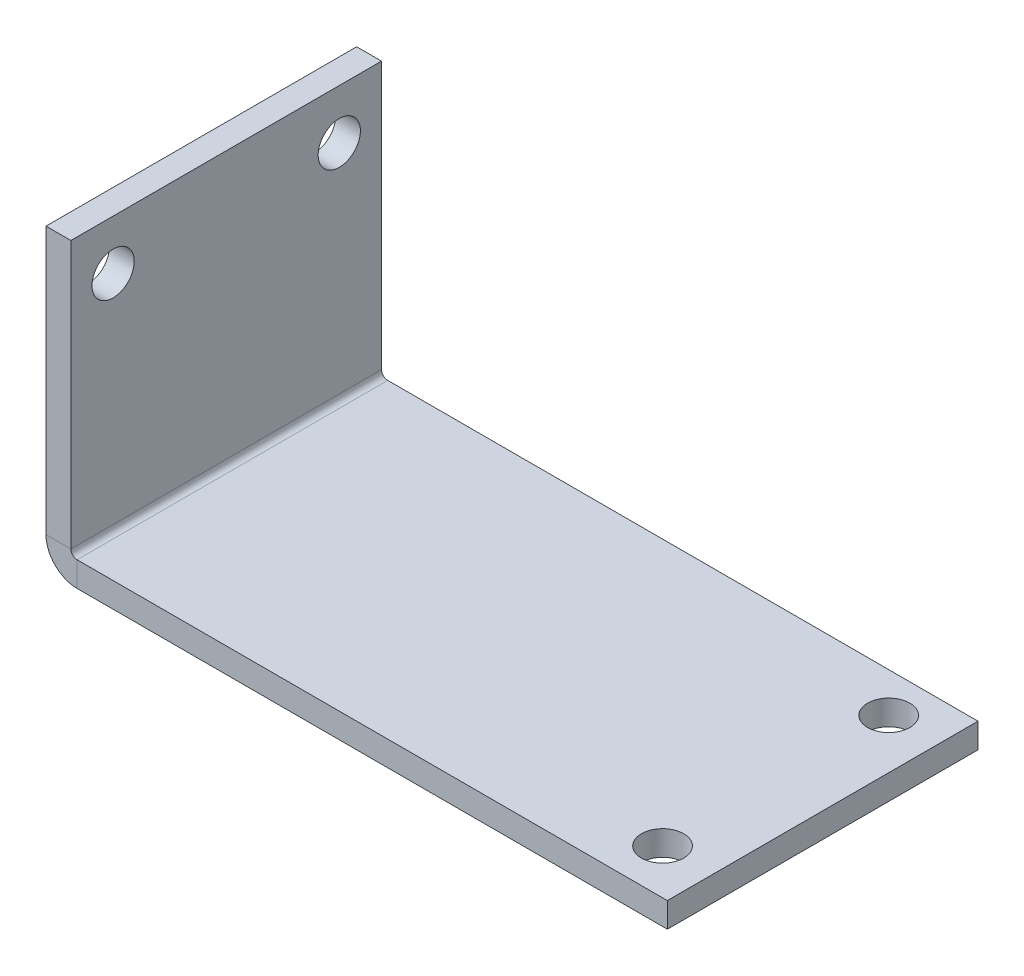
ISO-10303-21;
HEADER;
FILE_DESCRIPTION(('STEP AP214'),'2;1');
FILE_NAME('part.step','',(''),(''),'','','');
FILE_SCHEMA(('AUTOMOTIVE_DESIGN { 1 0 10303 214 1 1 1 1 }'));
ENDSEC;
DATA;
#1=APPLICATION_CONTEXT('core data for automotive mechanical design processes');
#2=APPLICATION_PROTOCOL_DEFINITION('international standard','automotive_design',2000,#1);
#3=PRODUCT_CONTEXT('',#1,'mechanical');
#4=PRODUCT('Part','Part','',(#3));
#5=PRODUCT_RELATED_PRODUCT_CATEGORY('part','',(#4));
#6=PRODUCT_DEFINITION_FORMATION('','',#4);
#7=PRODUCT_DEFINITION_CONTEXT('part definition',#1,'design');
#8=PRODUCT_DEFINITION('design','',#6,#7);
#9=PRODUCT_DEFINITION_SHAPE('','',#8);
#10=(LENGTH_UNIT() NAMED_UNIT(*) SI_UNIT(.MILLI.,.METRE.));
#11=(NAMED_UNIT(*) PLANE_ANGLE_UNIT() SI_UNIT($,.RADIAN.));
#12=(NAMED_UNIT(*) SI_UNIT($,.STERADIAN.) SOLID_ANGLE_UNIT());
#13=UNCERTAINTY_MEASURE_WITH_UNIT(LENGTH_MEASURE(1.E-05),#10,'distance_accuracy_value','');
#14=(GEOMETRIC_REPRESENTATION_CONTEXT(3) GLOBAL_UNCERTAINTY_ASSIGNED_CONTEXT((#13)) GLOBAL_UNIT_ASSIGNED_CONTEXT((#10,
#11,#12)) REPRESENTATION_CONTEXT('',''));
#15=CARTESIAN_POINT('',(0.,0.,0.));
#16=DIRECTION('',(0.,0.,1.));
#17=DIRECTION('',(1.,0.,0.));
#18=AXIS2_PLACEMENT_3D('',#15,#16,#17);
#19=CARTESIAN_POINT('',(0.,2.5,25.));
#20=DIRECTION('',(0.,0.,1.));
#21=DIRECTION('',(1.,0.,0.));
#22=AXIS2_PLACEMENT_3D('',#19,#20,#21);
#23=PLANE('',#22);
#24=DIRECTION('',(1.,0.,0.));
#25=VECTOR('',#24,1.);
#26=CARTESIAN_POINT('',(0.,2.5,25.));
#27=LINE('',#26,#25);
#28=CARTESIAN_POINT('',(0.,2.5,25.));
#29=VERTEX_POINT('',#28);
#30=CARTESIAN_POINT('',(2.,2.5,25.));
#31=VERTEX_POINT('',#30);
#32=EDGE_CURVE('E11',#29,#31,#27,.T.);
#33=ORIENTED_EDGE('',*,*,#32,.F.);
#34=CARTESIAN_POINT('',(2.5,2.5,25.));
#35=DIRECTION('',(0.,0.,1.));
#36=DIRECTION('',(1.,0.,0.));
#37=AXIS2_PLACEMENT_3D('',#34,#35,#36);
#38=CIRCLE('',#37,2.5);
#39=CARTESIAN_POINT('',(2.5,0.,25.));
#40=VERTEX_POINT('',#39);
#41=EDGE_CURVE('E149',#40,#29,#38,.F.);
#42=ORIENTED_EDGE('',*,*,#41,.F.);
#43=DIRECTION('',(0.,-1.,0.));
#44=VECTOR('',#43,1.);
#45=CARTESIAN_POINT('',(2.5,2.,25.));
#46=LINE('',#45,#44);
#47=CARTESIAN_POINT('',(2.5,2.,25.));
#48=VERTEX_POINT('',#47);
#49=EDGE_CURVE('E55',#48,#40,#46,.T.);
#50=ORIENTED_EDGE('',*,*,#49,.F.);
#51=CARTESIAN_POINT('',(2.5,2.5,25.));
#52=DIRECTION('',(0.,0.,1.));
#53=DIRECTION('',(1.,0.,0.));
#54=AXIS2_PLACEMENT_3D('',#51,#52,#53);
#55=CIRCLE('',#54,0.5);
#56=EDGE_CURVE('E140',#48,#31,#55,.F.);
#57=ORIENTED_EDGE('',*,*,#56,.T.);
#58=EDGE_LOOP('',(#33,#42,#50,#57));
#59=FACE_BOUND('',#58,.T.);
#60=ADVANCED_FACE('F45',(#59),#23,.T.);
#61=CARTESIAN_POINT('',(2.5,2.,25.));
#62=DIRECTION('',(0.,0.,1.));
#63=DIRECTION('',(1.,0.,0.));
#64=AXIS2_PLACEMENT_3D('',#61,#62,#63);
#65=PLANE('',#64);
#66=DIRECTION('',(0.,1.,0.));
#67=VECTOR('',#66,1.);
#68=CARTESIAN_POINT('',(0.,0.,25.));
#69=LINE('',#68,#67);
#70=CARTESIAN_POINT('',(0.,24.,25.));
#71=VERTEX_POINT('',#70);
#72=EDGE_CURVE('E235',#29,#71,#69,.T.);
#73=ORIENTED_EDGE('',*,*,#72,.F.);
#74=ORIENTED_EDGE('',*,*,#32,.T.);
#75=DIRECTION('',(0.,1.,0.));
#76=VECTOR('',#75,1.);
#77=CARTESIAN_POINT('',(2.,0.,25.));
#78=LINE('',#77,#76);
#79=CARTESIAN_POINT('',(2.,24.,25.));
#80=VERTEX_POINT('',#79);
#81=EDGE_CURVE('E104',#31,#80,#78,.T.);
#82=ORIENTED_EDGE('',*,*,#81,.T.);
#83=DIRECTION('',(1.,0.,0.));
#84=VECTOR('',#83,1.);
#85=CARTESIAN_POINT('',(0.,24.,25.));
#86=LINE('',#85,#84);
#87=EDGE_CURVE('E231',#71,#80,#86,.T.);
#88=ORIENTED_EDGE('',*,*,#87,.F.);
#89=EDGE_LOOP('',(#73,#74,#82,#88));
#90=FACE_BOUND('',#89,.T.);
#91=ADVANCED_FACE('F257',(#90),#65,.T.);
#92=CARTESIAN_POINT('',(2.5,0.,0.));
#93=DIRECTION('',(0.,0.,-1.));
#94=DIRECTION('',(-1.,0.,0.));
#95=AXIS2_PLACEMENT_3D('',#92,#93,#94);
#96=PLANE('',#95);
#97=DIRECTION('',(0.,1.,0.));
#98=VECTOR('',#97,1.);
#99=CARTESIAN_POINT('',(2.5,0.,0.));
#100=LINE('',#99,#98);
#101=CARTESIAN_POINT('',(2.5,0.,0.));
#102=VERTEX_POINT('',#101);
#103=CARTESIAN_POINT('',(2.5,2.,0.));
#104=VERTEX_POINT('',#103);
#105=EDGE_CURVE('E91',#102,#104,#100,.T.);
#106=ORIENTED_EDGE('',*,*,#105,.F.);
#107=CARTESIAN_POINT('',(2.5,2.5,0.));
#108=DIRECTION('',(0.,0.,1.));
#109=DIRECTION('',(1.,0.,0.));
#110=AXIS2_PLACEMENT_3D('',#107,#108,#109);
#111=CIRCLE('',#110,2.5);
#112=CARTESIAN_POINT('',(0.,2.5,0.));
#113=VERTEX_POINT('',#112);
#114=EDGE_CURVE('E168',#102,#113,#111,.F.);
#115=ORIENTED_EDGE('',*,*,#114,.T.);
#116=DIRECTION('',(-1.,0.,0.));
#117=VECTOR('',#116,1.);
#118=CARTESIAN_POINT('',(2.,2.5,0.));
#119=LINE('',#118,#117);
#120=CARTESIAN_POINT('',(2.,2.5,0.));
#121=VERTEX_POINT('',#120);
#122=EDGE_CURVE('E98',#121,#113,#119,.T.);
#123=ORIENTED_EDGE('',*,*,#122,.F.);
#124=CARTESIAN_POINT('',(2.5,2.5,0.));
#125=DIRECTION('',(0.,0.,1.));
#126=DIRECTION('',(1.,0.,0.));
#127=AXIS2_PLACEMENT_3D('',#124,#125,#126);
#128=CIRCLE('',#127,0.5);
#129=EDGE_CURVE('E179',#104,#121,#128,.F.);
#130=ORIENTED_EDGE('',*,*,#129,.F.);
#131=EDGE_LOOP('',(#106,#115,#123,#130));
#132=FACE_BOUND('',#131,.T.);
#133=ADVANCED_FACE('F255',(#132),#96,.T.);
#134=CARTESIAN_POINT('',(2.,2.5,0.));
#135=DIRECTION('',(0.,0.,-1.));
#136=DIRECTION('',(-1.,0.,0.));
#137=AXIS2_PLACEMENT_3D('',#134,#135,#136);
#138=PLANE('',#137);
#139=DIRECTION('',(-1.,0.,0.));
#140=VECTOR('',#139,1.);
#141=CARTESIAN_POINT('',(0.,0.,0.));
#142=LINE('',#141,#140);
#143=CARTESIAN_POINT('',(50.,0.,0.));
#144=VERTEX_POINT('',#143);
#145=EDGE_CURVE('E171',#144,#102,#142,.T.);
#146=ORIENTED_EDGE('',*,*,#145,.T.);
#147=ORIENTED_EDGE('',*,*,#105,.T.);
#148=DIRECTION('',(1.,0.,0.));
#149=VECTOR('',#148,1.);
#150=CARTESIAN_POINT('',(0.,2.,0.));
#151=LINE('',#150,#149);
#152=CARTESIAN_POINT('',(50.,2.,0.));
#153=VERTEX_POINT('',#152);
#154=EDGE_CURVE('E176',#153,#104,#151,.F.);
#155=ORIENTED_EDGE('',*,*,#154,.F.);
#156=DIRECTION('',(0.,-1.,0.));
#157=VECTOR('',#156,1.);
#158=CARTESIAN_POINT('',(50.,2.,0.));
#159=LINE('',#158,#157);
#160=EDGE_CURVE('E126',#153,#144,#159,.T.);
#161=ORIENTED_EDGE('',*,*,#160,.T.);
#162=EDGE_LOOP('',(#146,#147,#155,#161));
#163=FACE_BOUND('',#162,.T.);
#164=ADVANCED_FACE('F251',(#163),#138,.T.);
#165=CARTESIAN_POINT('',(2.,0.,25.));
#166=DIRECTION('',(-1.,0.,0.));
#167=DIRECTION('',(0.,0.,1.));
#168=AXIS2_PLACEMENT_3D('',#165,#166,#167);
#169=PLANE('',#168);
#170=CARTESIAN_POINT('',(2.,20.,21.6));
#171=DIRECTION('',(1.,0.,0.));
#172=DIRECTION('',(0.,0.,-1.));
#173=AXIS2_PLACEMENT_3D('',#170,#171,#172);
#174=CIRCLE('',#173,1.7);
#175=CARTESIAN_POINT('',(2.,20.,19.9));
#176=VERTEX_POINT('',#175);
#177=EDGE_CURVE('E211',#176,#176,#174,.T.);
#178=ORIENTED_EDGE('',*,*,#177,.F.);
#179=EDGE_LOOP('',(#178));
#180=FACE_BOUND('',#179,.T.);
#181=CARTESIAN_POINT('',(2.,20.,3.4));
#182=DIRECTION('',(1.,0.,0.));
#183=DIRECTION('',(0.,0.,-1.));
#184=AXIS2_PLACEMENT_3D('',#181,#182,#183);
#185=CIRCLE('',#184,1.7);
#186=CARTESIAN_POINT('',(2.,20.,1.7));
#187=VERTEX_POINT('',#186);
#188=EDGE_CURVE('E218',#187,#187,#185,.T.);
#189=ORIENTED_EDGE('',*,*,#188,.F.);
#190=EDGE_LOOP('',(#189));
#191=FACE_BOUND('',#190,.T.);
#192=DIRECTION('',(0.,1.,0.));
#193=VECTOR('',#192,1.);
#194=CARTESIAN_POINT('',(2.,0.,0.));
#195=LINE('',#194,#193);
#196=CARTESIAN_POINT('',(2.,24.,0.));
#197=VERTEX_POINT('',#196);
#198=EDGE_CURVE('E156',#121,#197,#195,.T.);
#199=ORIENTED_EDGE('',*,*,#198,.T.);
#200=DIRECTION('',(0.,0.,-1.));
#201=VECTOR('',#200,1.);
#202=CARTESIAN_POINT('',(2.,24.,25.));
#203=LINE('',#202,#201);
#204=EDGE_CURVE('E200',#80,#197,#203,.T.);
#205=ORIENTED_EDGE('',*,*,#204,.F.);
#206=ORIENTED_EDGE('',*,*,#81,.F.);
#207=DIRECTION('',(0.,0.,-1.));
#208=VECTOR('',#207,1.);
#209=CARTESIAN_POINT('',(2.,2.5,25.));
#210=LINE('',#209,#208);
#211=EDGE_CURVE('E155',#31,#121,#210,.T.);
#212=ORIENTED_EDGE('',*,*,#211,.T.);
#213=EDGE_LOOP('',(#199,#205,#206,#212));
#214=FACE_BOUND('',#213,.T.);
#215=ADVANCED_FACE('F263',(#180,#191,#214),#169,.F.);
#216=CARTESIAN_POINT('',(0.,24.,25.));
#217=DIRECTION('',(0.,1.,0.));
#218=DIRECTION('',(0.,0.,1.));
#219=AXIS2_PLACEMENT_3D('',#216,#217,#218);
#220=PLANE('',#219);
#221=DIRECTION('',(1.,0.,0.));
#222=VECTOR('',#221,1.);
#223=CARTESIAN_POINT('',(0.,24.,0.));
#224=LINE('',#223,#222);
#225=CARTESIAN_POINT('',(0.,24.,0.));
#226=VERTEX_POINT('',#225);
#227=EDGE_CURVE('E160',#226,#197,#224,.T.);
#228=ORIENTED_EDGE('',*,*,#227,.F.);
#229=DIRECTION('',(0.,0.,-1.));
#230=VECTOR('',#229,1.);
#231=CARTESIAN_POINT('',(0.,24.,25.));
#232=LINE('',#231,#230);
#233=EDGE_CURVE('E197',#71,#226,#232,.T.);
#234=ORIENTED_EDGE('',*,*,#233,.F.);
#235=ORIENTED_EDGE('',*,*,#87,.T.);
#236=ORIENTED_EDGE('',*,*,#204,.T.);
#237=EDGE_LOOP('',(#228,#234,#235,#236));
#238=FACE_BOUND('',#237,.T.);
#239=ADVANCED_FACE('F292',(#238),#220,.T.);
#240=CARTESIAN_POINT('',(0.,0.,25.));
#241=DIRECTION('',(-1.,0.,0.));
#242=DIRECTION('',(0.,0.,1.));
#243=AXIS2_PLACEMENT_3D('',#240,#241,#242);
#244=PLANE('',#243);
#245=CARTESIAN_POINT('',(0.,20.,21.6));
#246=DIRECTION('',(-1.,0.,0.));
#247=DIRECTION('',(0.,0.,1.));
#248=AXIS2_PLACEMENT_3D('',#245,#246,#247);
#249=CIRCLE('',#248,1.7);
#250=CARTESIAN_POINT('',(0.,20.,23.3));
#251=VERTEX_POINT('',#250);
#252=EDGE_CURVE('E48',#251,#251,#249,.T.);
#253=ORIENTED_EDGE('',*,*,#252,.F.);
#254=EDGE_LOOP('',(#253));
#255=FACE_BOUND('',#254,.T.);
#256=CARTESIAN_POINT('',(0.,20.,3.4));
#257=DIRECTION('',(-1.,0.,0.));
#258=DIRECTION('',(0.,0.,1.));
#259=AXIS2_PLACEMENT_3D('',#256,#257,#258);
#260=CIRCLE('',#259,1.7);
#261=CARTESIAN_POINT('',(0.,20.,5.1));
#262=VERTEX_POINT('',#261);
#263=EDGE_CURVE('E208',#262,#262,#260,.T.);
#264=ORIENTED_EDGE('',*,*,#263,.F.);
#265=EDGE_LOOP('',(#264));
#266=FACE_BOUND('',#265,.T.);
#267=DIRECTION('',(0.,1.,0.));
#268=VECTOR('',#267,1.);
#269=CARTESIAN_POINT('',(0.,0.,0.));
#270=LINE('',#269,#268);
#271=EDGE_CURVE('E164',#113,#226,#270,.T.);
#272=ORIENTED_EDGE('',*,*,#271,.F.);
#273=DIRECTION('',(0.,0.,-1.));
#274=VECTOR('',#273,1.);
#275=CARTESIAN_POINT('',(0.,2.5,25.));
#276=LINE('',#275,#274);
#277=EDGE_CURVE('E193',#29,#113,#276,.T.);
#278=ORIENTED_EDGE('',*,*,#277,.F.);
#279=ORIENTED_EDGE('',*,*,#72,.T.);
#280=ORIENTED_EDGE('',*,*,#233,.T.);
#281=EDGE_LOOP('',(#272,#278,#279,#280));
#282=FACE_BOUND('',#281,.T.);
#283=ADVANCED_FACE('F297',(#255,#266,#282),#244,.T.);
#284=CARTESIAN_POINT('',(2.5,2.5,25.));
#285=DIRECTION('',(0.,0.,-1.));
#286=DIRECTION('',(-1.,0.,0.));
#287=AXIS2_PLACEMENT_3D('',#284,#285,#286);
#288=CYLINDRICAL_SURFACE('',#287,2.5);
#289=ORIENTED_EDGE('',*,*,#114,.F.);
#290=DIRECTION('',(0.,0.,-1.));
#291=VECTOR('',#290,1.);
#292=CARTESIAN_POINT('',(2.5,0.,25.));
#293=LINE('',#292,#291);
#294=EDGE_CURVE('E189',#40,#102,#293,.T.);
#295=ORIENTED_EDGE('',*,*,#294,.F.);
#296=ORIENTED_EDGE('',*,*,#41,.T.);
#297=ORIENTED_EDGE('',*,*,#277,.T.);
#298=EDGE_LOOP('',(#289,#295,#296,#297));
#299=FACE_BOUND('',#298,.T.);
#300=ADVANCED_FACE('F244',(#299),#288,.T.);
#301=CARTESIAN_POINT('',(0.,0.,25.));
#302=DIRECTION('',(0.,-1.,0.));
#303=DIRECTION('',(0.,0.,-1.));
#304=AXIS2_PLACEMENT_3D('',#301,#302,#303);
#305=PLANE('',#304);
#306=CARTESIAN_POINT('',(46.,0.,3.18425360381557));
#307=DIRECTION('',(0.,-1.,0.));
#308=DIRECTION('',(0.,0.,-1.));
#309=AXIS2_PLACEMENT_3D('',#306,#307,#308);
#310=CIRCLE('',#309,1.7);
#311=CARTESIAN_POINT('',(46.,0.,1.48425360381557));
#312=VERTEX_POINT('',#311);
#313=EDGE_CURVE('E224',#312,#312,#310,.T.);
#314=ORIENTED_EDGE('',*,*,#313,.F.);
#315=EDGE_LOOP('',(#314));
#316=FACE_BOUND('',#315,.T.);
#317=CARTESIAN_POINT('',(46.,0.,21.3842536038156));
#318=DIRECTION('',(0.,-1.,0.));
#319=DIRECTION('',(0.,0.,-1.));
#320=AXIS2_PLACEMENT_3D('',#317,#318,#319);
#321=CIRCLE('',#320,1.7);
#322=CARTESIAN_POINT('',(46.,0.,19.6842536038156));
#323=VERTEX_POINT('',#322);
#324=EDGE_CURVE('E495',#323,#323,#321,.T.);
#325=ORIENTED_EDGE('',*,*,#324,.F.);
#326=EDGE_LOOP('',(#325));
#327=FACE_BOUND('',#326,.T.);
#328=ORIENTED_EDGE('',*,*,#145,.F.);
#329=DIRECTION('',(0.,0.,-1.));
#330=VECTOR('',#329,1.);
#331=CARTESIAN_POINT('',(50.,0.,25.));
#332=LINE('',#331,#330);
#333=CARTESIAN_POINT('',(50.,0.,25.));
#334=VERTEX_POINT('',#333);
#335=EDGE_CURVE('E129',#334,#144,#332,.T.);
#336=ORIENTED_EDGE('',*,*,#335,.F.);
#337=DIRECTION('',(-1.,0.,0.));
#338=VECTOR('',#337,1.);
#339=CARTESIAN_POINT('',(0.,0.,25.));
#340=LINE('',#339,#338);
#341=EDGE_CURVE('E145',#334,#40,#340,.T.);
#342=ORIENTED_EDGE('',*,*,#341,.T.);
#343=ORIENTED_EDGE('',*,*,#294,.T.);
#344=EDGE_LOOP('',(#328,#336,#342,#343));
#345=FACE_BOUND('',#344,.T.);
#346=ADVANCED_FACE('F250',(#316,#327,#345),#305,.T.);
#347=CARTESIAN_POINT('',(50.,2.,25.));
#348=DIRECTION('',(1.,0.,0.));
#349=DIRECTION('',(0.,0.,-1.));
#350=AXIS2_PLACEMENT_3D('',#347,#348,#349);
#351=PLANE('',#350);
#352=ORIENTED_EDGE('',*,*,#160,.F.);
#353=DIRECTION('',(0.,0.,-1.));
#354=VECTOR('',#353,1.);
#355=CARTESIAN_POINT('',(50.,2.,25.));
#356=LINE('',#355,#354);
#357=CARTESIAN_POINT('',(50.,2.,25.));
#358=VERTEX_POINT('',#357);
#359=EDGE_CURVE('E120',#358,#153,#356,.T.);
#360=ORIENTED_EDGE('',*,*,#359,.F.);
#361=DIRECTION('',(0.,-1.,0.));
#362=VECTOR('',#361,1.);
#363=CARTESIAN_POINT('',(50.,2.,25.));
#364=LINE('',#363,#362);
#365=EDGE_CURVE('E124',#358,#334,#364,.T.);
#366=ORIENTED_EDGE('',*,*,#365,.T.);
#367=ORIENTED_EDGE('',*,*,#335,.T.);
#368=EDGE_LOOP('',(#352,#360,#366,#367));
#369=FACE_BOUND('',#368,.T.);
#370=ADVANCED_FACE('F122',(#369),#351,.T.);
#371=CARTESIAN_POINT('',(0.,2.,25.));
#372=DIRECTION('',(0.,-1.,0.));
#373=DIRECTION('',(0.,0.,-1.));
#374=AXIS2_PLACEMENT_3D('',#371,#372,#373);
#375=PLANE('',#374);
#376=CARTESIAN_POINT('',(46.,2.,3.18425360381557));
#377=DIRECTION('',(0.,1.,0.));
#378=DIRECTION('',(0.,0.,1.));
#379=AXIS2_PLACEMENT_3D('',#376,#377,#378);
#380=CIRCLE('',#379,1.7);
#381=CARTESIAN_POINT('',(46.,2.,4.88425360381556));
#382=VERTEX_POINT('',#381);
#383=EDGE_CURVE('E493',#382,#382,#380,.T.);
#384=ORIENTED_EDGE('',*,*,#383,.F.);
#385=EDGE_LOOP('',(#384));
#386=FACE_BOUND('',#385,.T.);
#387=CARTESIAN_POINT('',(46.,2.,21.3842536038156));
#388=DIRECTION('',(0.,1.,0.));
#389=DIRECTION('',(0.,0.,1.));
#390=AXIS2_PLACEMENT_3D('',#387,#388,#389);
#391=CIRCLE('',#390,1.7);
#392=CARTESIAN_POINT('',(46.,2.,23.0842536038156));
#393=VERTEX_POINT('',#392);
#394=EDGE_CURVE('E496',#393,#393,#391,.T.);
#395=ORIENTED_EDGE('',*,*,#394,.F.);
#396=EDGE_LOOP('',(#395));
#397=FACE_BOUND('',#396,.T.);
#398=ORIENTED_EDGE('',*,*,#154,.T.);
#399=DIRECTION('',(0.,0.,-1.));
#400=VECTOR('',#399,1.);
#401=CARTESIAN_POINT('',(2.5,2.,25.));
#402=LINE('',#401,#400);
#403=EDGE_CURVE('E130',#48,#104,#402,.T.);
#404=ORIENTED_EDGE('',*,*,#403,.F.);
#405=DIRECTION('',(1.,0.,0.));
#406=VECTOR('',#405,1.);
#407=CARTESIAN_POINT('',(0.,2.,25.));
#408=LINE('',#407,#406);
#409=EDGE_CURVE('E134',#358,#48,#408,.F.);
#410=ORIENTED_EDGE('',*,*,#409,.F.);
#411=ORIENTED_EDGE('',*,*,#359,.T.);
#412=EDGE_LOOP('',(#398,#404,#410,#411));
#413=FACE_BOUND('',#412,.T.);
#414=ADVANCED_FACE('F135',(#386,#397,#413),#375,.F.);
#415=CARTESIAN_POINT('',(2.5,2.5,25.));
#416=DIRECTION('',(0.,0.,-1.));
#417=DIRECTION('',(-1.,0.,0.));
#418=AXIS2_PLACEMENT_3D('',#415,#416,#417);
#419=CYLINDRICAL_SURFACE('',#418,0.5);
#420=ORIENTED_EDGE('',*,*,#129,.T.);
#421=ORIENTED_EDGE('',*,*,#211,.F.);
#422=ORIENTED_EDGE('',*,*,#56,.F.);
#423=ORIENTED_EDGE('',*,*,#403,.T.);
#424=EDGE_LOOP('',(#420,#421,#422,#423));
#425=FACE_BOUND('',#424,.T.);
#426=ADVANCED_FACE('F253',(#425),#419,.F.);
#427=CARTESIAN_POINT('',(2.5,2.5,25.));
#428=DIRECTION('',(0.,0.,1.));
#429=DIRECTION('',(1.,0.,0.));
#430=AXIS2_PLACEMENT_3D('',#427,#428,#429);
#431=PLANE('',#430);
#432=ORIENTED_EDGE('',*,*,#409,.T.);
#433=ORIENTED_EDGE('',*,*,#49,.T.);
#434=ORIENTED_EDGE('',*,*,#341,.F.);
#435=ORIENTED_EDGE('',*,*,#365,.F.);
#436=EDGE_LOOP('',(#432,#433,#434,#435));
#437=FACE_BOUND('',#436,.T.);
#438=ADVANCED_FACE('F143',(#437),#431,.T.);
#439=CARTESIAN_POINT('',(2.5,2.5,0.));
#440=DIRECTION('',(0.,0.,1.));
#441=DIRECTION('',(1.,0.,0.));
#442=AXIS2_PLACEMENT_3D('',#439,#440,#441);
#443=PLANE('',#442);
#444=ORIENTED_EDGE('',*,*,#198,.F.);
#445=ORIENTED_EDGE('',*,*,#122,.T.);
#446=ORIENTED_EDGE('',*,*,#271,.T.);
#447=ORIENTED_EDGE('',*,*,#227,.T.);
#448=EDGE_LOOP('',(#444,#445,#446,#447));
#449=FACE_BOUND('',#448,.T.);
#450=ADVANCED_FACE('F341',(#449),#443,.F.);
#451=CARTESIAN_POINT('',(-8.,20.,3.4));
#452=DIRECTION('',(1.,0.,0.));
#453=DIRECTION('',(0.,0.,-1.));
#454=AXIS2_PLACEMENT_3D('',#451,#452,#453);
#455=CYLINDRICAL_SURFACE('',#454,1.7);
#456=ORIENTED_EDGE('',*,*,#263,.T.);
#457=EDGE_LOOP('',(#456));
#458=FACE_BOUND('',#457,.T.);
#459=ORIENTED_EDGE('',*,*,#188,.T.);
#460=EDGE_LOOP('',(#459));
#461=FACE_BOUND('',#460,.T.);
#462=ADVANCED_FACE('F351',(#458,#461),#455,.F.);
#463=CARTESIAN_POINT('',(-8.,20.,21.6));
#464=DIRECTION('',(1.,0.,0.));
#465=DIRECTION('',(0.,0.,-1.));
#466=AXIS2_PLACEMENT_3D('',#463,#464,#465);
#467=CYLINDRICAL_SURFACE('',#466,1.7);
#468=ORIENTED_EDGE('',*,*,#252,.T.);
#469=EDGE_LOOP('',(#468));
#470=FACE_BOUND('',#469,.T.);
#471=ORIENTED_EDGE('',*,*,#177,.T.);
#472=EDGE_LOOP('',(#471));
#473=FACE_BOUND('',#472,.T.);
#474=ADVANCED_FACE('F378',(#470,#473),#467,.F.);
#475=CARTESIAN_POINT('',(46.,-8.,21.3842536038156));
#476=DIRECTION('',(0.,1.,0.));
#477=DIRECTION('',(0.,0.,1.));
#478=AXIS2_PLACEMENT_3D('',#475,#476,#477);
#479=CYLINDRICAL_SURFACE('',#478,1.7);
#480=ORIENTED_EDGE('',*,*,#324,.T.);
#481=EDGE_LOOP('',(#480));
#482=FACE_BOUND('',#481,.T.);
#483=ORIENTED_EDGE('',*,*,#394,.T.);
#484=EDGE_LOOP('',(#483));
#485=FACE_BOUND('',#484,.T.);
#486=ADVANCED_FACE('F388',(#482,#485),#479,.F.);
#487=CARTESIAN_POINT('',(46.,-8.,3.18425360381557));
#488=DIRECTION('',(0.,1.,0.));
#489=DIRECTION('',(0.,0.,1.));
#490=AXIS2_PLACEMENT_3D('',#487,#488,#489);
#491=CYLINDRICAL_SURFACE('',#490,1.7);
#492=ORIENTED_EDGE('',*,*,#313,.T.);
#493=EDGE_LOOP('',(#492));
#494=FACE_BOUND('',#493,.T.);
#495=ORIENTED_EDGE('',*,*,#383,.T.);
#496=EDGE_LOOP('',(#495));
#497=FACE_BOUND('',#496,.T.);
#498=ADVANCED_FACE('F415',(#494,#497),#491,.F.);
#499=CLOSED_SHELL('',(#60,#91,#133,#164,#215,#239,#283,#300,#346,#370,#414,#426,#438,#450,#462,
#474,#486,#498));
#500=MANIFOLD_SOLID_BREP('B2',#499);
#501=ADVANCED_BREP_SHAPE_REPRESENTATION('',(#18,#500),#14);
#502=SHAPE_DEFINITION_REPRESENTATION(#9,#501);
ENDSEC;
END-ISO-10303-21;
